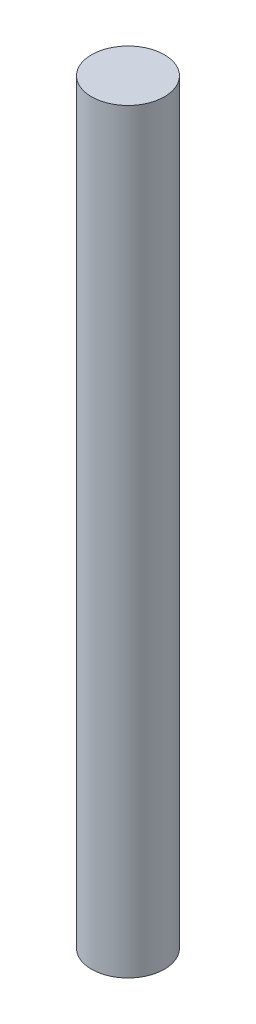
ISO-10303-21;
HEADER;
FILE_DESCRIPTION(('STEP AP214'),'2;1');
FILE_NAME('part.step','',(''),(''),'','','');
FILE_SCHEMA(('AUTOMOTIVE_DESIGN { 1 0 10303 214 1 1 1 1 }'));
ENDSEC;
DATA;
#1=APPLICATION_CONTEXT('core data for automotive mechanical design processes');
#2=APPLICATION_PROTOCOL_DEFINITION('international standard','automotive_design',2000,#1);
#3=PRODUCT_CONTEXT('',#1,'mechanical');
#4=PRODUCT('Part','Part','',(#3));
#5=PRODUCT_RELATED_PRODUCT_CATEGORY('part','',(#4));
#6=PRODUCT_DEFINITION_FORMATION('','',#4);
#7=PRODUCT_DEFINITION_CONTEXT('part definition',#1,'design');
#8=PRODUCT_DEFINITION('design','',#6,#7);
#9=PRODUCT_DEFINITION_SHAPE('','',#8);
#10=(LENGTH_UNIT() NAMED_UNIT(*) SI_UNIT(.MILLI.,.METRE.));
#11=(NAMED_UNIT(*) PLANE_ANGLE_UNIT() SI_UNIT($,.RADIAN.));
#12=(NAMED_UNIT(*) SI_UNIT($,.STERADIAN.) SOLID_ANGLE_UNIT());
#13=UNCERTAINTY_MEASURE_WITH_UNIT(LENGTH_MEASURE(1.E-05),#10,'distance_accuracy_value','');
#14=(GEOMETRIC_REPRESENTATION_CONTEXT(3) GLOBAL_UNCERTAINTY_ASSIGNED_CONTEXT((#13)) GLOBAL_UNIT_ASSIGNED_CONTEXT((#10,
#11,#12)) REPRESENTATION_CONTEXT('',''));
#15=CARTESIAN_POINT('',(0.,0.,0.));
#16=DIRECTION('',(0.,0.,1.));
#17=DIRECTION('',(1.,0.,0.));
#18=AXIS2_PLACEMENT_3D('',#15,#16,#17);
#19=CARTESIAN_POINT('',(-4.28625,88.9,0.));
#20=DIRECTION('',(0.,1.,0.));
#21=DIRECTION('',(0.,0.,1.));
#22=AXIS2_PLACEMENT_3D('',#19,#20,#21);
#23=PLANE('',#22);
#24=CARTESIAN_POINT('',(0.,88.9,0.));
#25=DIRECTION('',(0.,1.,0.));
#26=DIRECTION('',(0.,0.,1.));
#27=AXIS2_PLACEMENT_3D('',#24,#25,#26);
#28=CIRCLE('',#27,4.28625);
#29=CARTESIAN_POINT('',(0.,88.9,4.28625));
#30=VERTEX_POINT('',#29);
#31=EDGE_CURVE('E10',#30,#30,#28,.T.);
#32=ORIENTED_EDGE('',*,*,#31,.T.);
#33=EDGE_LOOP('',(#32));
#34=FACE_BOUND('',#33,.T.);
#35=ADVANCED_FACE('F39',(#34),#23,.T.);
#36=CARTESIAN_POINT('',(0.,88.9,0.));
#37=DIRECTION('',(0.,1.,0.));
#38=DIRECTION('',(0.,0.,1.));
#39=AXIS2_PLACEMENT_3D('',#36,#37,#38);
#40=CYLINDRICAL_SURFACE('',#39,4.28625);
#41=CARTESIAN_POINT('',(0.,0.,0.));
#42=DIRECTION('',(0.,1.,0.));
#43=DIRECTION('',(0.,0.,1.));
#44=AXIS2_PLACEMENT_3D('',#41,#42,#43);
#45=CIRCLE('',#44,4.28625);
#46=CARTESIAN_POINT('',(0.,0.,4.28625));
#47=VERTEX_POINT('',#46);
#48=EDGE_CURVE('E45',#47,#47,#45,.T.);
#49=ORIENTED_EDGE('',*,*,#48,.T.);
#50=EDGE_LOOP('',(#49));
#51=FACE_BOUND('',#50,.T.);
#52=ORIENTED_EDGE('',*,*,#31,.F.);
#53=EDGE_LOOP('',(#52));
#54=FACE_BOUND('',#53,.T.);
#55=ADVANCED_FACE('F51',(#51,#54),#40,.T.);
#56=CARTESIAN_POINT('',(-4.28625,0.,0.));
#57=DIRECTION('',(0.,-1.,0.));
#58=DIRECTION('',(0.,0.,-1.));
#59=AXIS2_PLACEMENT_3D('',#56,#57,#58);
#60=PLANE('',#59);
#61=ORIENTED_EDGE('',*,*,#48,.F.);
#62=EDGE_LOOP('',(#61));
#63=FACE_BOUND('',#62,.T.);
#64=ADVANCED_FACE('F54',(#63),#60,.T.);
#65=CLOSED_SHELL('',(#35,#55,#64));
#66=MANIFOLD_SOLID_BREP('B2',#65);
#67=ADVANCED_BREP_SHAPE_REPRESENTATION('',(#18,#66),#14);
#68=SHAPE_DEFINITION_REPRESENTATION(#9,#67);
ENDSEC;
END-ISO-10303-21;
